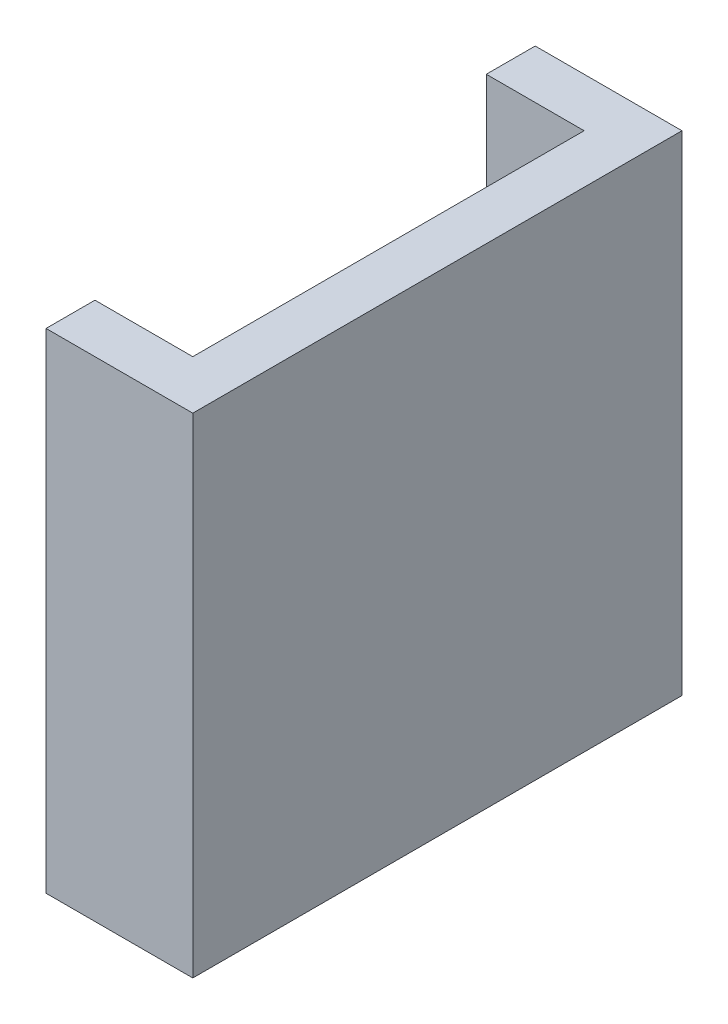
ISO-10303-21;
HEADER;
FILE_DESCRIPTION(('STEP AP214'),'2;1');
FILE_NAME('part.step','',(''),(''),'','','');
FILE_SCHEMA(('AUTOMOTIVE_DESIGN { 1 0 10303 214 1 1 1 1 }'));
ENDSEC;
DATA;
#1=APPLICATION_CONTEXT('core data for automotive mechanical design processes');
#2=APPLICATION_PROTOCOL_DEFINITION('international standard','automotive_design',2000,#1);
#3=PRODUCT_CONTEXT('',#1,'mechanical');
#4=PRODUCT('Part','Part','',(#3));
#5=PRODUCT_RELATED_PRODUCT_CATEGORY('part','',(#4));
#6=PRODUCT_DEFINITION_FORMATION('','',#4);
#7=PRODUCT_DEFINITION_CONTEXT('part definition',#1,'design');
#8=PRODUCT_DEFINITION('design','',#6,#7);
#9=PRODUCT_DEFINITION_SHAPE('','',#8);
#10=(LENGTH_UNIT() NAMED_UNIT(*) SI_UNIT(.MILLI.,.METRE.));
#11=(NAMED_UNIT(*) PLANE_ANGLE_UNIT() SI_UNIT($,.RADIAN.));
#12=(NAMED_UNIT(*) SI_UNIT($,.STERADIAN.) SOLID_ANGLE_UNIT());
#13=UNCERTAINTY_MEASURE_WITH_UNIT(LENGTH_MEASURE(1.E-05),#10,'distance_accuracy_value','');
#14=(GEOMETRIC_REPRESENTATION_CONTEXT(3) GLOBAL_UNCERTAINTY_ASSIGNED_CONTEXT((#13)) GLOBAL_UNIT_ASSIGNED_CONTEXT((#10,
#11,#12)) REPRESENTATION_CONTEXT('',''));
#15=CARTESIAN_POINT('',(0.,0.,0.));
#16=DIRECTION('',(0.,0.,1.));
#17=DIRECTION('',(1.,0.,0.));
#18=AXIS2_PLACEMENT_3D('',#15,#16,#17);
#19=CARTESIAN_POINT('',(41.637384713574,29.57820078302,0.));
#20=DIRECTION('',(-1.,-8.74227765734797E-08,0.));
#21=DIRECTION('',(-8.74227765734797E-08,1.,0.));
#22=AXIS2_PLACEMENT_3D('',#19,#20,#21);
#23=PLANE('',#22);
#24=DIRECTION('',(0.,0.,1.));
#25=VECTOR('',#24,1.);
#26=CARTESIAN_POINT('',(41.637384713574,29.57820078302,0.));
#27=LINE('',#26,#25);
#28=CARTESIAN_POINT('',(41.637384713574,29.57820078302,0.45));
#29=VERTEX_POINT('',#28);
#30=CARTESIAN_POINT('',(41.637384713574,29.57820078302,0.5));
#31=VERTEX_POINT('',#30);
#32=EDGE_CURVE('E112',#29,#31,#27,.T.);
#33=ORIENTED_EDGE('',*,*,#32,.F.);
#34=DIRECTION('',(-8.74227765734797E-08,1.,0.));
#35=VECTOR('',#34,1.);
#36=CARTESIAN_POINT('',(41.637384713574,29.57820078302,0.45));
#37=LINE('',#36,#35);
#38=CARTESIAN_POINT('',(41.637384757285,29.07820078302,0.45));
#39=VERTEX_POINT('',#38);
#40=EDGE_CURVE('E11',#39,#29,#37,.T.);
#41=ORIENTED_EDGE('',*,*,#40,.F.);
#42=DIRECTION('',(0.,0.,1.));
#43=VECTOR('',#42,1.);
#44=CARTESIAN_POINT('',(41.637384757285,29.07820078302,0.));
#45=LINE('',#44,#43);
#46=CARTESIAN_POINT('',(41.637384757285,29.07820078302,0.5));
#47=VERTEX_POINT('',#46);
#48=EDGE_CURVE('E158',#39,#47,#45,.T.);
#49=ORIENTED_EDGE('',*,*,#48,.T.);
#50=DIRECTION('',(8.74227765734797E-08,-1.,0.));
#51=VECTOR('',#50,1.);
#52=CARTESIAN_POINT('',(41.637384713574,29.57820078302,0.5));
#53=LINE('',#52,#51);
#54=EDGE_CURVE('E148',#31,#47,#53,.T.);
#55=ORIENTED_EDGE('',*,*,#54,.F.);
#56=EDGE_LOOP('',(#33,#41,#49,#55));
#57=FACE_BOUND('',#56,.T.);
#58=ADVANCED_FACE('F16',(#57),#23,.T.);
#59=CARTESIAN_POINT('',(41.737384713574,29.578200791762,0.45));
#60=DIRECTION('',(0.,0.,1.));
#61=DIRECTION('',(1.,0.,0.));
#62=AXIS2_PLACEMENT_3D('',#59,#60,#61);
#63=PLANE('',#62);
#64=ORIENTED_EDGE('',*,*,#40,.T.);
#65=DIRECTION('',(-1.,-8.74227765734797E-08,0.));
#66=VECTOR('',#65,1.);
#67=CARTESIAN_POINT('',(41.737384713574,29.578200791762,0.45));
#68=LINE('',#67,#66);
#69=CARTESIAN_POINT('',(41.737384713574,29.578200791762,0.45));
#70=VERTEX_POINT('',#69);
#71=EDGE_CURVE('E154',#70,#29,#68,.T.);
#72=ORIENTED_EDGE('',*,*,#71,.F.);
#73=DIRECTION('',(8.74227765734797E-08,-1.,0.));
#74=VECTOR('',#73,1.);
#75=CARTESIAN_POINT('',(41.737384713574,29.578200791762,0.45));
#76=LINE('',#75,#74);
#77=CARTESIAN_POINT('',(41.737384757285,29.078200791762,0.45));
#78=VERTEX_POINT('',#77);
#79=EDGE_CURVE('E27',#70,#78,#76,.T.);
#80=ORIENTED_EDGE('',*,*,#79,.T.);
#81=DIRECTION('',(-1.,-8.74227765734797E-08,0.));
#82=VECTOR('',#81,1.);
#83=CARTESIAN_POINT('',(41.737384757285,29.078200791762,0.45));
#84=LINE('',#83,#82);
#85=EDGE_CURVE('E161',#78,#39,#84,.T.);
#86=ORIENTED_EDGE('',*,*,#85,.T.);
#87=EDGE_LOOP('',(#64,#72,#80,#86));
#88=FACE_BOUND('',#87,.T.);
#89=ADVANCED_FACE('F189',(#88),#63,.F.);
#90=CARTESIAN_POINT('',(41.737384713574,29.578200791762,0.05));
#91=DIRECTION('',(-1.,-8.74227765734797E-08,0.));
#92=DIRECTION('',(-8.74227765734797E-08,1.,0.));
#93=AXIS2_PLACEMENT_3D('',#90,#91,#92);
#94=PLANE('',#93);
#95=DIRECTION('',(0.,0.,1.));
#96=VECTOR('',#95,1.);
#97=CARTESIAN_POINT('',(41.737384713574,29.578200791762,0.05));
#98=LINE('',#97,#96);
#99=CARTESIAN_POINT('',(41.737384713574,29.578200791762,0.05));
#100=VERTEX_POINT('',#99);
#101=EDGE_CURVE('E157',#100,#70,#98,.T.);
#102=ORIENTED_EDGE('',*,*,#101,.F.);
#103=DIRECTION('',(8.74227765734797E-08,-1.,0.));
#104=VECTOR('',#103,1.);
#105=CARTESIAN_POINT('',(41.737384713574,29.578200791762,0.05));
#106=LINE('',#105,#104);
#107=CARTESIAN_POINT('',(41.737384757285,29.078200791762,0.05));
#108=VERTEX_POINT('',#107);
#109=EDGE_CURVE('E41',#100,#108,#106,.T.);
#110=ORIENTED_EDGE('',*,*,#109,.T.);
#111=DIRECTION('',(0.,0.,1.));
#112=VECTOR('',#111,1.);
#113=CARTESIAN_POINT('',(41.737384757285,29.078200791762,0.05));
#114=LINE('',#113,#112);
#115=EDGE_CURVE('E166',#108,#78,#114,.T.);
#116=ORIENTED_EDGE('',*,*,#115,.T.);
#117=ORIENTED_EDGE('',*,*,#79,.F.);
#118=EDGE_LOOP('',(#102,#110,#116,#117));
#119=FACE_BOUND('',#118,.T.);
#120=ADVANCED_FACE('F214',(#119),#94,.T.);
#121=CARTESIAN_POINT('',(41.737384713574,29.578200791762,0.05));
#122=DIRECTION('',(0.,0.,1.));
#123=DIRECTION('',(1.,0.,0.));
#124=AXIS2_PLACEMENT_3D('',#121,#122,#123);
#125=PLANE('',#124);
#126=DIRECTION('',(-1.,-8.74227765734797E-08,0.));
#127=VECTOR('',#126,1.);
#128=CARTESIAN_POINT('',(41.737384757285,29.078200791762,0.05));
#129=LINE('',#128,#127);
#130=CARTESIAN_POINT('',(41.637384757285,29.07820078302,0.05));
#131=VERTEX_POINT('',#130);
#132=EDGE_CURVE('E169',#108,#131,#129,.T.);
#133=ORIENTED_EDGE('',*,*,#132,.F.);
#134=ORIENTED_EDGE('',*,*,#109,.F.);
#135=DIRECTION('',(-1.,-8.74227765734797E-08,0.));
#136=VECTOR('',#135,1.);
#137=CARTESIAN_POINT('',(41.737384713574,29.578200791762,0.05));
#138=LINE('',#137,#136);
#139=CARTESIAN_POINT('',(41.637384713574,29.57820078302,0.05));
#140=VERTEX_POINT('',#139);
#141=EDGE_CURVE('E126',#100,#140,#138,.T.);
#142=ORIENTED_EDGE('',*,*,#141,.T.);
#143=DIRECTION('',(-8.74227765734797E-08,1.,0.));
#144=VECTOR('',#143,1.);
#145=CARTESIAN_POINT('',(41.637384713574,29.57820078302,0.05));
#146=LINE('',#145,#144);
#147=EDGE_CURVE('E142',#131,#140,#146,.T.);
#148=ORIENTED_EDGE('',*,*,#147,.F.);
#149=EDGE_LOOP('',(#133,#134,#142,#148));
#150=FACE_BOUND('',#149,.T.);
#151=ADVANCED_FACE('F18',(#150),#125,.T.);
#152=CARTESIAN_POINT('',(41.637384713574,29.57820078302,0.));
#153=DIRECTION('',(-1.,-8.74227765734797E-08,0.));
#154=DIRECTION('',(-8.74227765734797E-08,1.,0.));
#155=AXIS2_PLACEMENT_3D('',#152,#153,#154);
#156=PLANE('',#155);
#157=DIRECTION('',(0.,0.,1.));
#158=VECTOR('',#157,1.);
#159=CARTESIAN_POINT('',(41.637384713574,29.57820078302,0.));
#160=LINE('',#159,#158);
#161=CARTESIAN_POINT('',(41.637384713574,29.57820078302,0.));
#162=VERTEX_POINT('',#161);
#163=EDGE_CURVE('E151',#162,#140,#160,.T.);
#164=ORIENTED_EDGE('',*,*,#163,.F.);
#165=DIRECTION('',(8.74227765734797E-08,-1.,0.));
#166=VECTOR('',#165,1.);
#167=CARTESIAN_POINT('',(41.637384713574,29.57820078302,0.));
#168=LINE('',#167,#166);
#169=CARTESIAN_POINT('',(41.637384757285,29.07820078302,0.));
#170=VERTEX_POINT('',#169);
#171=EDGE_CURVE('E144',#162,#170,#168,.T.);
#172=ORIENTED_EDGE('',*,*,#171,.T.);
#173=DIRECTION('',(0.,0.,1.));
#174=VECTOR('',#173,1.);
#175=CARTESIAN_POINT('',(41.637384757285,29.07820078302,0.));
#176=LINE('',#175,#174);
#177=EDGE_CURVE('E171',#170,#131,#176,.T.);
#178=ORIENTED_EDGE('',*,*,#177,.T.);
#179=ORIENTED_EDGE('',*,*,#147,.T.);
#180=EDGE_LOOP('',(#164,#172,#178,#179));
#181=FACE_BOUND('',#180,.T.);
#182=ADVANCED_FACE('F222',(#181),#156,.T.);
#183=CARTESIAN_POINT('',(41.787384713574,29.578200796133,0.));
#184=DIRECTION('',(0.,0.,1.));
#185=DIRECTION('',(1.,0.,0.));
#186=AXIS2_PLACEMENT_3D('',#183,#184,#185);
#187=PLANE('',#186);
#188=DIRECTION('',(-1.,-8.74227765734797E-08,0.));
#189=VECTOR('',#188,1.);
#190=CARTESIAN_POINT('',(41.787384757285,29.078200796133,0.));
#191=LINE('',#190,#189);
#192=CARTESIAN_POINT('',(41.787384757285,29.078200796133,0.));
#193=VERTEX_POINT('',#192);
#194=EDGE_CURVE('E162',#193,#170,#191,.T.);
#195=ORIENTED_EDGE('',*,*,#194,.T.);
#196=ORIENTED_EDGE('',*,*,#171,.F.);
#197=DIRECTION('',(-1.,-8.74227765734797E-08,0.));
#198=VECTOR('',#197,1.);
#199=CARTESIAN_POINT('',(41.787384713574,29.578200796133,0.));
#200=LINE('',#199,#198);
#201=CARTESIAN_POINT('',(41.787384713574,29.578200796133,0.));
#202=VERTEX_POINT('',#201);
#203=EDGE_CURVE('E117',#202,#162,#200,.T.);
#204=ORIENTED_EDGE('',*,*,#203,.F.);
#205=DIRECTION('',(8.74227765734797E-08,-1.,0.));
#206=VECTOR('',#205,1.);
#207=CARTESIAN_POINT('',(41.787384713574,29.578200796133,0.));
#208=LINE('',#207,#206);
#209=EDGE_CURVE('E124',#202,#193,#208,.T.);
#210=ORIENTED_EDGE('',*,*,#209,.T.);
#211=EDGE_LOOP('',(#195,#196,#204,#210));
#212=FACE_BOUND('',#211,.T.);
#213=ADVANCED_FACE('F238',(#212),#187,.F.);
#214=CARTESIAN_POINT('',(41.787384757285,29.078200796133,0.));
#215=DIRECTION('',(8.74227765734797E-08,-1.,0.));
#216=DIRECTION('',(0.,0.,-1.));
#217=AXIS2_PLACEMENT_3D('',#214,#215,#216);
#218=PLANE('',#217);
#219=ORIENTED_EDGE('',*,*,#177,.F.);
#220=ORIENTED_EDGE('',*,*,#194,.F.);
#221=DIRECTION('',(0.,0.,1.));
#222=VECTOR('',#221,1.);
#223=CARTESIAN_POINT('',(41.787384757285,29.078200796133,0.));
#224=LINE('',#223,#222);
#225=CARTESIAN_POINT('',(41.787384757285,29.078200796133,0.5));
#226=VERTEX_POINT('',#225);
#227=EDGE_CURVE('E133',#193,#226,#224,.T.);
#228=ORIENTED_EDGE('',*,*,#227,.T.);
#229=DIRECTION('',(-1.,-8.74227765734797E-08,0.));
#230=VECTOR('',#229,1.);
#231=CARTESIAN_POINT('',(41.787384757285,29.078200796133,0.5));
#232=LINE('',#231,#230);
#233=EDGE_CURVE('E130',#226,#47,#232,.T.);
#234=ORIENTED_EDGE('',*,*,#233,.T.);
#235=ORIENTED_EDGE('',*,*,#48,.F.);
#236=ORIENTED_EDGE('',*,*,#85,.F.);
#237=ORIENTED_EDGE('',*,*,#115,.F.);
#238=ORIENTED_EDGE('',*,*,#132,.T.);
#239=EDGE_LOOP('',(#219,#220,#228,#234,#235,#236,#237,#238));
#240=FACE_BOUND('',#239,.T.);
#241=ADVANCED_FACE('F186',(#240),#218,.T.);
#242=CARTESIAN_POINT('',(41.787384713574,29.578200796133,0.5));
#243=DIRECTION('',(0.,0.,1.));
#244=DIRECTION('',(1.,0.,0.));
#245=AXIS2_PLACEMENT_3D('',#242,#243,#244);
#246=PLANE('',#245);
#247=DIRECTION('',(8.74227765734797E-08,-1.,0.));
#248=VECTOR('',#247,1.);
#249=CARTESIAN_POINT('',(41.787384713574,29.578200796133,0.5));
#250=LINE('',#249,#248);
#251=CARTESIAN_POINT('',(41.787384713574,29.578200796133,0.5));
#252=VERTEX_POINT('',#251);
#253=EDGE_CURVE('E122',#252,#226,#250,.T.);
#254=ORIENTED_EDGE('',*,*,#253,.F.);
#255=DIRECTION('',(-1.,-8.74227765734797E-08,0.));
#256=VECTOR('',#255,1.);
#257=CARTESIAN_POINT('',(41.787384713574,29.578200796133,0.5));
#258=LINE('',#257,#256);
#259=EDGE_CURVE('E20',#252,#31,#258,.T.);
#260=ORIENTED_EDGE('',*,*,#259,.T.);
#261=ORIENTED_EDGE('',*,*,#54,.T.);
#262=ORIENTED_EDGE('',*,*,#233,.F.);
#263=EDGE_LOOP('',(#254,#260,#261,#262));
#264=FACE_BOUND('',#263,.T.);
#265=ADVANCED_FACE('F128',(#264),#246,.T.);
#266=CARTESIAN_POINT('',(41.787384713574,29.578200796133,0.));
#267=DIRECTION('',(8.74227765734797E-08,-1.,0.));
#268=DIRECTION('',(0.,0.,-1.));
#269=AXIS2_PLACEMENT_3D('',#266,#267,#268);
#270=PLANE('',#269);
#271=ORIENTED_EDGE('',*,*,#141,.F.);
#272=ORIENTED_EDGE('',*,*,#101,.T.);
#273=ORIENTED_EDGE('',*,*,#71,.T.);
#274=ORIENTED_EDGE('',*,*,#32,.T.);
#275=ORIENTED_EDGE('',*,*,#259,.F.);
#276=DIRECTION('',(0.,0.,1.));
#277=VECTOR('',#276,1.);
#278=CARTESIAN_POINT('',(41.787384713574,29.578200796133,0.));
#279=LINE('',#278,#277);
#280=EDGE_CURVE('E109',#202,#252,#279,.T.);
#281=ORIENTED_EDGE('',*,*,#280,.F.);
#282=ORIENTED_EDGE('',*,*,#203,.T.);
#283=ORIENTED_EDGE('',*,*,#163,.T.);
#284=EDGE_LOOP('',(#271,#272,#273,#274,#275,#281,#282,#283));
#285=FACE_BOUND('',#284,.T.);
#286=ADVANCED_FACE('F107',(#285),#270,.F.);
#287=CARTESIAN_POINT('',(41.787384713574,29.578200796133,0.));
#288=DIRECTION('',(-1.,-8.74227765734797E-08,0.));
#289=DIRECTION('',(-8.74227765734797E-08,1.,0.));
#290=AXIS2_PLACEMENT_3D('',#287,#288,#289);
#291=PLANE('',#290);
#292=ORIENTED_EDGE('',*,*,#253,.T.);
#293=ORIENTED_EDGE('',*,*,#227,.F.);
#294=ORIENTED_EDGE('',*,*,#209,.F.);
#295=ORIENTED_EDGE('',*,*,#280,.T.);
#296=EDGE_LOOP('',(#292,#293,#294,#295));
#297=FACE_BOUND('',#296,.T.);
#298=ADVANCED_FACE('F120',(#297),#291,.F.);
#299=CLOSED_SHELL('',(#58,#89,#120,#151,#182,#213,#241,#265,#286,#298));
#300=MANIFOLD_SOLID_BREP('B1',#299);
#301=ADVANCED_BREP_SHAPE_REPRESENTATION('',(#18,#300),#14);
#302=SHAPE_DEFINITION_REPRESENTATION(#9,#301);
ENDSEC;
END-ISO-10303-21;
